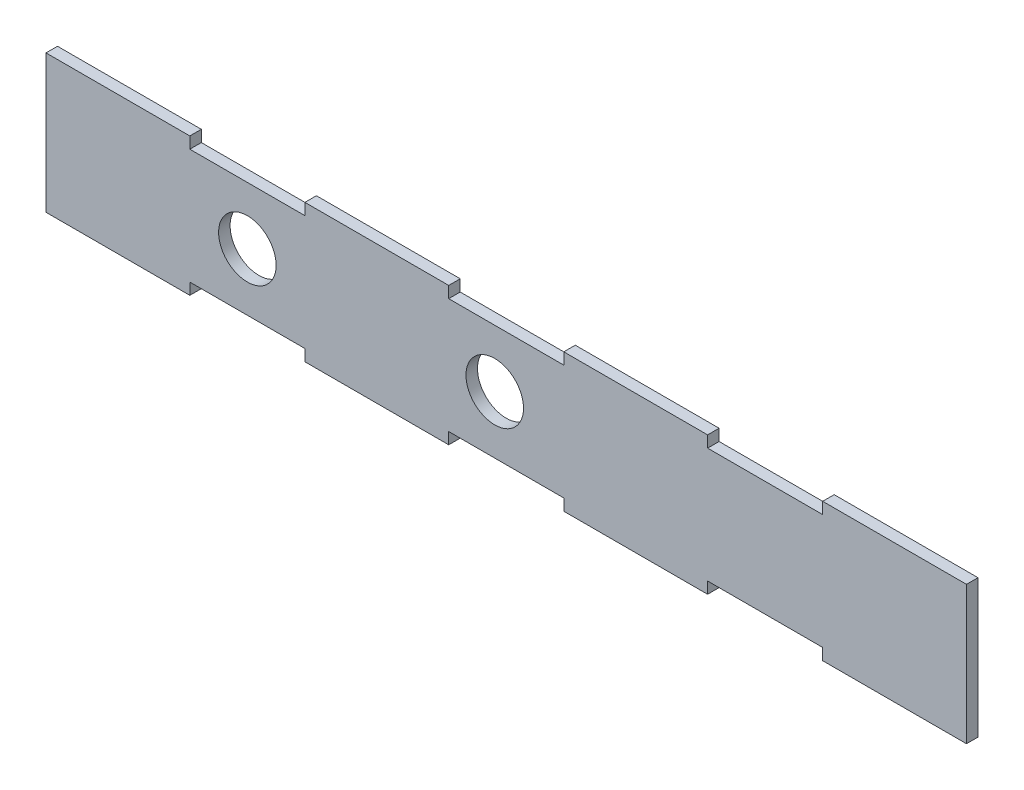
ISO-10303-21;
HEADER;
FILE_DESCRIPTION(('STEP AP214'),'2;1');
FILE_NAME('part.step','',(''),(''),'','','');
FILE_SCHEMA(('AUTOMOTIVE_DESIGN { 1 0 10303 214 1 1 1 1 }'));
ENDSEC;
DATA;
#1=APPLICATION_CONTEXT('core data for automotive mechanical design processes');
#2=APPLICATION_PROTOCOL_DEFINITION('international standard','automotive_design',2000,#1);
#3=PRODUCT_CONTEXT('',#1,'mechanical');
#4=PRODUCT('Part','Part','',(#3));
#5=PRODUCT_RELATED_PRODUCT_CATEGORY('part','',(#4));
#6=PRODUCT_DEFINITION_FORMATION('','',#4);
#7=PRODUCT_DEFINITION_CONTEXT('part definition',#1,'design');
#8=PRODUCT_DEFINITION('design','',#6,#7);
#9=PRODUCT_DEFINITION_SHAPE('','',#8);
#10=(LENGTH_UNIT() NAMED_UNIT(*) SI_UNIT(.MILLI.,.METRE.));
#11=(NAMED_UNIT(*) PLANE_ANGLE_UNIT() SI_UNIT($,.RADIAN.));
#12=(NAMED_UNIT(*) SI_UNIT($,.STERADIAN.) SOLID_ANGLE_UNIT());
#13=UNCERTAINTY_MEASURE_WITH_UNIT(LENGTH_MEASURE(1.E-05),#10,'distance_accuracy_value','');
#14=(GEOMETRIC_REPRESENTATION_CONTEXT(3) GLOBAL_UNCERTAINTY_ASSIGNED_CONTEXT((#13)) GLOBAL_UNIT_ASSIGNED_CONTEXT((#10,
#11,#12)) REPRESENTATION_CONTEXT('',''));
#15=CARTESIAN_POINT('',(0.,0.,0.));
#16=DIRECTION('',(0.,0.,1.));
#17=DIRECTION('',(1.,0.,0.));
#18=AXIS2_PLACEMENT_3D('',#15,#16,#17);
#19=CARTESIAN_POINT('',(115.,0.,2.));
#20=DIRECTION('',(-1.,0.,0.));
#21=DIRECTION('',(0.,0.,1.));
#22=AXIS2_PLACEMENT_3D('',#19,#20,#21);
#23=PLANE('',#22);
#24=DIRECTION('',(0.,1.,0.));
#25=VECTOR('',#24,1.);
#26=CARTESIAN_POINT('',(115.,0.,0.));
#27=LINE('',#26,#25);
#28=CARTESIAN_POINT('',(115.,0.,0.));
#29=VERTEX_POINT('',#28);
#30=CARTESIAN_POINT('',(115.,2.,0.));
#31=VERTEX_POINT('',#30);
#32=EDGE_CURVE('E261',#29,#31,#27,.T.);
#33=ORIENTED_EDGE('',*,*,#32,.T.);
#34=DIRECTION('',(0.,0.,-1.));
#35=VECTOR('',#34,1.);
#36=CARTESIAN_POINT('',(115.,2.,2.));
#37=LINE('',#36,#35);
#38=CARTESIAN_POINT('',(115.,2.,2.));
#39=VERTEX_POINT('',#38);
#40=EDGE_CURVE('E11',#39,#31,#37,.T.);
#41=ORIENTED_EDGE('',*,*,#40,.F.);
#42=DIRECTION('',(0.,1.,0.));
#43=VECTOR('',#42,1.);
#44=CARTESIAN_POINT('',(115.,0.,2.));
#45=LINE('',#44,#43);
#46=CARTESIAN_POINT('',(115.,0.,2.));
#47=VERTEX_POINT('',#46);
#48=EDGE_CURVE('E853',#47,#39,#45,.T.);
#49=ORIENTED_EDGE('',*,*,#48,.F.);
#50=DIRECTION('',(0.,0.,-1.));
#51=VECTOR('',#50,1.);
#52=CARTESIAN_POINT('',(115.,0.,2.));
#53=LINE('',#52,#51);
#54=EDGE_CURVE('E54',#47,#29,#53,.T.);
#55=ORIENTED_EDGE('',*,*,#54,.T.);
#56=EDGE_LOOP('',(#33,#41,#49,#55));
#57=FACE_BOUND('',#56,.T.);
#58=ADVANCED_FACE('F37',(#57),#23,.F.);
#59=CARTESIAN_POINT('',(0.,2.,2.));
#60=DIRECTION('',(0.,1.,0.));
#61=DIRECTION('',(0.,0.,1.));
#62=AXIS2_PLACEMENT_3D('',#59,#60,#61);
#63=PLANE('',#62);
#64=DIRECTION('',(1.,0.,0.));
#65=VECTOR('',#64,1.);
#66=CARTESIAN_POINT('',(0.,2.,0.));
#67=LINE('',#66,#65);
#68=CARTESIAN_POINT('',(135.,2.,0.));
#69=VERTEX_POINT('',#68);
#70=EDGE_CURVE('E263',#31,#69,#67,.T.);
#71=ORIENTED_EDGE('',*,*,#70,.T.);
#72=DIRECTION('',(0.,0.,-1.));
#73=VECTOR('',#72,1.);
#74=CARTESIAN_POINT('',(135.,2.,2.));
#75=LINE('',#74,#73);
#76=CARTESIAN_POINT('',(135.,2.,2.));
#77=VERTEX_POINT('',#76);
#78=EDGE_CURVE('E46',#77,#69,#75,.T.);
#79=ORIENTED_EDGE('',*,*,#78,.F.);
#80=DIRECTION('',(1.,0.,0.));
#81=VECTOR('',#80,1.);
#82=CARTESIAN_POINT('',(0.,2.,2.));
#83=LINE('',#82,#81);
#84=EDGE_CURVE('E152',#39,#77,#83,.T.);
#85=ORIENTED_EDGE('',*,*,#84,.F.);
#86=ORIENTED_EDGE('',*,*,#40,.T.);
#87=EDGE_LOOP('',(#71,#79,#85,#86));
#88=FACE_BOUND('',#87,.T.);
#89=ADVANCED_FACE('F393',(#88),#63,.F.);
#90=CARTESIAN_POINT('',(135.,0.,2.));
#91=DIRECTION('',(-1.,0.,0.));
#92=DIRECTION('',(0.,0.,1.));
#93=AXIS2_PLACEMENT_3D('',#90,#91,#92);
#94=PLANE('',#93);
#95=DIRECTION('',(0.,1.,0.));
#96=VECTOR('',#95,1.);
#97=CARTESIAN_POINT('',(135.,0.,0.));
#98=LINE('',#97,#96);
#99=CARTESIAN_POINT('',(135.,0.,0.));
#100=VERTEX_POINT('',#99);
#101=EDGE_CURVE('E266',#100,#69,#98,.T.);
#102=ORIENTED_EDGE('',*,*,#101,.F.);
#103=DIRECTION('',(0.,0.,-1.));
#104=VECTOR('',#103,1.);
#105=CARTESIAN_POINT('',(135.,0.,2.));
#106=LINE('',#105,#104);
#107=CARTESIAN_POINT('',(135.,0.,2.));
#108=VERTEX_POINT('',#107);
#109=EDGE_CURVE('E386',#108,#100,#106,.T.);
#110=ORIENTED_EDGE('',*,*,#109,.F.);
#111=DIRECTION('',(0.,1.,0.));
#112=VECTOR('',#111,1.);
#113=CARTESIAN_POINT('',(135.,0.,2.));
#114=LINE('',#113,#112);
#115=EDGE_CURVE('E392',#108,#77,#114,.T.);
#116=ORIENTED_EDGE('',*,*,#115,.T.);
#117=ORIENTED_EDGE('',*,*,#78,.T.);
#118=EDGE_LOOP('',(#102,#110,#116,#117));
#119=FACE_BOUND('',#118,.T.);
#120=ADVANCED_FACE('F390',(#119),#94,.T.);
#121=CARTESIAN_POINT('',(0.,0.,2.));
#122=DIRECTION('',(0.,1.,0.));
#123=DIRECTION('',(-1.,0.,0.));
#124=AXIS2_PLACEMENT_3D('',#121,#122,#123);
#125=PLANE('',#124);
#126=DIRECTION('',(1.,0.,0.));
#127=VECTOR('',#126,1.);
#128=CARTESIAN_POINT('',(0.,0.,0.));
#129=LINE('',#128,#127);
#130=CARTESIAN_POINT('',(160.,0.,0.));
#131=VERTEX_POINT('',#130);
#132=EDGE_CURVE('E269',#100,#131,#129,.T.);
#133=ORIENTED_EDGE('',*,*,#132,.T.);
#134=DIRECTION('',(0.,0.,-1.));
#135=VECTOR('',#134,1.);
#136=CARTESIAN_POINT('',(160.,0.,2.));
#137=LINE('',#136,#135);
#138=CARTESIAN_POINT('',(160.,0.,2.));
#139=VERTEX_POINT('',#138);
#140=EDGE_CURVE('E383',#139,#131,#137,.T.);
#141=ORIENTED_EDGE('',*,*,#140,.F.);
#142=DIRECTION('',(1.,0.,0.));
#143=VECTOR('',#142,1.);
#144=CARTESIAN_POINT('',(0.,0.,2.));
#145=LINE('',#144,#143);
#146=EDGE_CURVE('E411',#108,#139,#145,.T.);
#147=ORIENTED_EDGE('',*,*,#146,.F.);
#148=ORIENTED_EDGE('',*,*,#109,.T.);
#149=EDGE_LOOP('',(#133,#141,#147,#148));
#150=FACE_BOUND('',#149,.T.);
#151=ADVANCED_FACE('F402',(#150),#125,.F.);
#152=CARTESIAN_POINT('',(160.,0.,2.));
#153=DIRECTION('',(-1.,0.,0.));
#154=DIRECTION('',(0.,0.,1.));
#155=AXIS2_PLACEMENT_3D('',#152,#153,#154);
#156=PLANE('',#155);
#157=DIRECTION('',(0.,1.,0.));
#158=VECTOR('',#157,1.);
#159=CARTESIAN_POINT('',(160.,0.,0.));
#160=LINE('',#159,#158);
#161=CARTESIAN_POINT('',(160.,24.,0.));
#162=VERTEX_POINT('',#161);
#163=EDGE_CURVE('E271',#131,#162,#160,.T.);
#164=ORIENTED_EDGE('',*,*,#163,.T.);
#165=DIRECTION('',(0.,0.,-1.));
#166=VECTOR('',#165,1.);
#167=CARTESIAN_POINT('',(160.,24.,2.));
#168=LINE('',#167,#166);
#169=CARTESIAN_POINT('',(160.,24.,2.));
#170=VERTEX_POINT('',#169);
#171=EDGE_CURVE('E380',#170,#162,#168,.T.);
#172=ORIENTED_EDGE('',*,*,#171,.F.);
#173=DIRECTION('',(0.,1.,0.));
#174=VECTOR('',#173,1.);
#175=CARTESIAN_POINT('',(160.,0.,2.));
#176=LINE('',#175,#174);
#177=EDGE_CURVE('E408',#139,#170,#176,.T.);
#178=ORIENTED_EDGE('',*,*,#177,.F.);
#179=ORIENTED_EDGE('',*,*,#140,.T.);
#180=EDGE_LOOP('',(#164,#172,#178,#179));
#181=FACE_BOUND('',#180,.T.);
#182=ADVANCED_FACE('F406',(#181),#156,.F.);
#183=CARTESIAN_POINT('',(0.,24.,2.));
#184=DIRECTION('',(0.,-1.,0.));
#185=DIRECTION('',(1.,0.,0.));
#186=AXIS2_PLACEMENT_3D('',#183,#184,#185);
#187=PLANE('',#186);
#188=DIRECTION('',(-1.,0.,0.));
#189=VECTOR('',#188,1.);
#190=CARTESIAN_POINT('',(0.,24.,0.));
#191=LINE('',#190,#189);
#192=CARTESIAN_POINT('',(135.,24.,0.));
#193=VERTEX_POINT('',#192);
#194=EDGE_CURVE('E273',#162,#193,#191,.T.);
#195=ORIENTED_EDGE('',*,*,#194,.T.);
#196=DIRECTION('',(0.,0.,-1.));
#197=VECTOR('',#196,1.);
#198=CARTESIAN_POINT('',(135.,24.,2.));
#199=LINE('',#198,#197);
#200=CARTESIAN_POINT('',(135.,24.,2.));
#201=VERTEX_POINT('',#200);
#202=EDGE_CURVE('E377',#201,#193,#199,.T.);
#203=ORIENTED_EDGE('',*,*,#202,.F.);
#204=DIRECTION('',(-1.,0.,0.));
#205=VECTOR('',#204,1.);
#206=CARTESIAN_POINT('',(0.,24.,2.));
#207=LINE('',#206,#205);
#208=EDGE_CURVE('E410',#170,#201,#207,.T.);
#209=ORIENTED_EDGE('',*,*,#208,.F.);
#210=ORIENTED_EDGE('',*,*,#171,.T.);
#211=EDGE_LOOP('',(#195,#203,#209,#210));
#212=FACE_BOUND('',#211,.T.);
#213=ADVANCED_FACE('F735',(#212),#187,.F.);
#214=CARTESIAN_POINT('',(135.,0.,2.));
#215=DIRECTION('',(1.,0.,0.));
#216=DIRECTION('',(0.,0.,-1.));
#217=AXIS2_PLACEMENT_3D('',#214,#215,#216);
#218=PLANE('',#217);
#219=DIRECTION('',(0.,-1.,0.));
#220=VECTOR('',#219,1.);
#221=CARTESIAN_POINT('',(135.,0.,0.));
#222=LINE('',#221,#220);
#223=CARTESIAN_POINT('',(135.,22.,0.));
#224=VERTEX_POINT('',#223);
#225=EDGE_CURVE('E275',#193,#224,#222,.T.);
#226=ORIENTED_EDGE('',*,*,#225,.T.);
#227=DIRECTION('',(0.,0.,-1.));
#228=VECTOR('',#227,1.);
#229=CARTESIAN_POINT('',(135.,22.,2.));
#230=LINE('',#229,#228);
#231=CARTESIAN_POINT('',(135.,22.,2.));
#232=VERTEX_POINT('',#231);
#233=EDGE_CURVE('E375',#232,#224,#230,.T.);
#234=ORIENTED_EDGE('',*,*,#233,.F.);
#235=DIRECTION('',(0.,-1.,0.));
#236=VECTOR('',#235,1.);
#237=CARTESIAN_POINT('',(135.,0.,2.));
#238=LINE('',#237,#236);
#239=EDGE_CURVE('E413',#201,#232,#238,.T.);
#240=ORIENTED_EDGE('',*,*,#239,.F.);
#241=ORIENTED_EDGE('',*,*,#202,.T.);
#242=EDGE_LOOP('',(#226,#234,#240,#241));
#243=FACE_BOUND('',#242,.T.);
#244=ADVANCED_FACE('F725',(#243),#218,.F.);
#245=CARTESIAN_POINT('',(0.,22.,2.));
#246=DIRECTION('',(0.,1.,0.));
#247=DIRECTION('',(0.,0.,1.));
#248=AXIS2_PLACEMENT_3D('',#245,#246,#247);
#249=PLANE('',#248);
#250=DIRECTION('',(1.,0.,0.));
#251=VECTOR('',#250,1.);
#252=CARTESIAN_POINT('',(0.,22.,0.));
#253=LINE('',#252,#251);
#254=CARTESIAN_POINT('',(115.,22.,0.));
#255=VERTEX_POINT('',#254);
#256=EDGE_CURVE('E278',#255,#224,#253,.T.);
#257=ORIENTED_EDGE('',*,*,#256,.F.);
#258=DIRECTION('',(0.,0.,-1.));
#259=VECTOR('',#258,1.);
#260=CARTESIAN_POINT('',(115.,22.,2.));
#261=LINE('',#260,#259);
#262=CARTESIAN_POINT('',(115.,22.,2.));
#263=VERTEX_POINT('',#262);
#264=EDGE_CURVE('E373',#263,#255,#261,.T.);
#265=ORIENTED_EDGE('',*,*,#264,.F.);
#266=DIRECTION('',(1.,0.,0.));
#267=VECTOR('',#266,1.);
#268=CARTESIAN_POINT('',(0.,22.,2.));
#269=LINE('',#268,#267);
#270=EDGE_CURVE('E419',#263,#232,#269,.T.);
#271=ORIENTED_EDGE('',*,*,#270,.T.);
#272=ORIENTED_EDGE('',*,*,#233,.T.);
#273=EDGE_LOOP('',(#257,#265,#271,#272));
#274=FACE_BOUND('',#273,.T.);
#275=ADVANCED_FACE('F715',(#274),#249,.T.);
#276=CARTESIAN_POINT('',(115.,0.,2.));
#277=DIRECTION('',(1.,0.,0.));
#278=DIRECTION('',(0.,0.,-1.));
#279=AXIS2_PLACEMENT_3D('',#276,#277,#278);
#280=PLANE('',#279);
#281=DIRECTION('',(0.,-1.,0.));
#282=VECTOR('',#281,1.);
#283=CARTESIAN_POINT('',(115.,0.,0.));
#284=LINE('',#283,#282);
#285=CARTESIAN_POINT('',(115.,24.,0.));
#286=VERTEX_POINT('',#285);
#287=EDGE_CURVE('E281',#286,#255,#284,.T.);
#288=ORIENTED_EDGE('',*,*,#287,.F.);
#289=DIRECTION('',(0.,0.,-1.));
#290=VECTOR('',#289,1.);
#291=CARTESIAN_POINT('',(115.,24.,2.));
#292=LINE('',#291,#290);
#293=CARTESIAN_POINT('',(115.,24.,2.));
#294=VERTEX_POINT('',#293);
#295=EDGE_CURVE('E371',#294,#286,#292,.T.);
#296=ORIENTED_EDGE('',*,*,#295,.F.);
#297=DIRECTION('',(0.,-1.,0.));
#298=VECTOR('',#297,1.);
#299=CARTESIAN_POINT('',(115.,0.,2.));
#300=LINE('',#299,#298);
#301=EDGE_CURVE('E422',#294,#263,#300,.T.);
#302=ORIENTED_EDGE('',*,*,#301,.T.);
#303=ORIENTED_EDGE('',*,*,#264,.T.);
#304=EDGE_LOOP('',(#288,#296,#302,#303));
#305=FACE_BOUND('',#304,.T.);
#306=ADVANCED_FACE('F704',(#305),#280,.T.);
#307=CARTESIAN_POINT('',(0.,24.,2.));
#308=DIRECTION('',(0.,1.,0.));
#309=DIRECTION('',(0.,0.,1.));
#310=AXIS2_PLACEMENT_3D('',#307,#308,#309);
#311=PLANE('',#310);
#312=DIRECTION('',(1.,0.,0.));
#313=VECTOR('',#312,1.);
#314=CARTESIAN_POINT('',(0.,24.,0.));
#315=LINE('',#314,#313);
#316=CARTESIAN_POINT('',(90.,24.,0.));
#317=VERTEX_POINT('',#316);
#318=EDGE_CURVE('E284',#317,#286,#315,.T.);
#319=ORIENTED_EDGE('',*,*,#318,.F.);
#320=DIRECTION('',(0.,0.,-1.));
#321=VECTOR('',#320,1.);
#322=CARTESIAN_POINT('',(90.,24.,2.));
#323=LINE('',#322,#321);
#324=CARTESIAN_POINT('',(90.,24.,2.));
#325=VERTEX_POINT('',#324);
#326=EDGE_CURVE('E369',#325,#317,#323,.T.);
#327=ORIENTED_EDGE('',*,*,#326,.F.);
#328=DIRECTION('',(1.,0.,0.));
#329=VECTOR('',#328,1.);
#330=CARTESIAN_POINT('',(0.,24.,2.));
#331=LINE('',#330,#329);
#332=EDGE_CURVE('E425',#325,#294,#331,.T.);
#333=ORIENTED_EDGE('',*,*,#332,.T.);
#334=ORIENTED_EDGE('',*,*,#295,.T.);
#335=EDGE_LOOP('',(#319,#327,#333,#334));
#336=FACE_BOUND('',#335,.T.);
#337=ADVANCED_FACE('F694',(#336),#311,.T.);
#338=CARTESIAN_POINT('',(90.,0.,2.));
#339=DIRECTION('',(1.,0.,0.));
#340=DIRECTION('',(0.,0.,-1.));
#341=AXIS2_PLACEMENT_3D('',#338,#339,#340);
#342=PLANE('',#341);
#343=DIRECTION('',(0.,-1.,0.));
#344=VECTOR('',#343,1.);
#345=CARTESIAN_POINT('',(90.,0.,0.));
#346=LINE('',#345,#344);
#347=CARTESIAN_POINT('',(90.,22.,0.));
#348=VERTEX_POINT('',#347);
#349=EDGE_CURVE('E287',#317,#348,#346,.T.);
#350=ORIENTED_EDGE('',*,*,#349,.T.);
#351=DIRECTION('',(0.,0.,-1.));
#352=VECTOR('',#351,1.);
#353=CARTESIAN_POINT('',(90.,22.,2.));
#354=LINE('',#353,#352);
#355=CARTESIAN_POINT('',(90.,22.,2.));
#356=VERTEX_POINT('',#355);
#357=EDGE_CURVE('E367',#356,#348,#354,.T.);
#358=ORIENTED_EDGE('',*,*,#357,.F.);
#359=DIRECTION('',(0.,-1.,0.));
#360=VECTOR('',#359,1.);
#361=CARTESIAN_POINT('',(90.,0.,2.));
#362=LINE('',#361,#360);
#363=EDGE_CURVE('E428',#325,#356,#362,.T.);
#364=ORIENTED_EDGE('',*,*,#363,.F.);
#365=ORIENTED_EDGE('',*,*,#326,.T.);
#366=EDGE_LOOP('',(#350,#358,#364,#365));
#367=FACE_BOUND('',#366,.T.);
#368=ADVANCED_FACE('F684',(#367),#342,.F.);
#369=CARTESIAN_POINT('',(0.,22.,2.));
#370=DIRECTION('',(0.,1.,0.));
#371=DIRECTION('',(0.,0.,1.));
#372=AXIS2_PLACEMENT_3D('',#369,#370,#371);
#373=PLANE('',#372);
#374=DIRECTION('',(1.,0.,0.));
#375=VECTOR('',#374,1.);
#376=CARTESIAN_POINT('',(0.,22.,0.));
#377=LINE('',#376,#375);
#378=CARTESIAN_POINT('',(70.,22.,0.));
#379=VERTEX_POINT('',#378);
#380=EDGE_CURVE('E290',#379,#348,#377,.T.);
#381=ORIENTED_EDGE('',*,*,#380,.F.);
#382=DIRECTION('',(0.,0.,-1.));
#383=VECTOR('',#382,1.);
#384=CARTESIAN_POINT('',(70.,22.,2.));
#385=LINE('',#384,#383);
#386=CARTESIAN_POINT('',(70.,22.,2.));
#387=VERTEX_POINT('',#386);
#388=EDGE_CURVE('E365',#387,#379,#385,.T.);
#389=ORIENTED_EDGE('',*,*,#388,.F.);
#390=DIRECTION('',(1.,0.,0.));
#391=VECTOR('',#390,1.);
#392=CARTESIAN_POINT('',(0.,22.,2.));
#393=LINE('',#392,#391);
#394=EDGE_CURVE('E430',#387,#356,#393,.T.);
#395=ORIENTED_EDGE('',*,*,#394,.T.);
#396=ORIENTED_EDGE('',*,*,#357,.T.);
#397=EDGE_LOOP('',(#381,#389,#395,#396));
#398=FACE_BOUND('',#397,.T.);
#399=ADVANCED_FACE('F674',(#398),#373,.T.);
#400=CARTESIAN_POINT('',(70.,0.,2.));
#401=DIRECTION('',(1.,0.,0.));
#402=DIRECTION('',(0.,0.,-1.));
#403=AXIS2_PLACEMENT_3D('',#400,#401,#402);
#404=PLANE('',#403);
#405=DIRECTION('',(0.,-1.,0.));
#406=VECTOR('',#405,1.);
#407=CARTESIAN_POINT('',(70.,0.,0.));
#408=LINE('',#407,#406);
#409=CARTESIAN_POINT('',(70.,24.,0.));
#410=VERTEX_POINT('',#409);
#411=EDGE_CURVE('E293',#410,#379,#408,.T.);
#412=ORIENTED_EDGE('',*,*,#411,.F.);
#413=DIRECTION('',(0.,0.,-1.));
#414=VECTOR('',#413,1.);
#415=CARTESIAN_POINT('',(70.,24.,2.));
#416=LINE('',#415,#414);
#417=CARTESIAN_POINT('',(70.,24.,2.));
#418=VERTEX_POINT('',#417);
#419=EDGE_CURVE('E363',#418,#410,#416,.T.);
#420=ORIENTED_EDGE('',*,*,#419,.F.);
#421=DIRECTION('',(0.,-1.,0.));
#422=VECTOR('',#421,1.);
#423=CARTESIAN_POINT('',(70.,0.,2.));
#424=LINE('',#423,#422);
#425=EDGE_CURVE('E433',#418,#387,#424,.T.);
#426=ORIENTED_EDGE('',*,*,#425,.T.);
#427=ORIENTED_EDGE('',*,*,#388,.T.);
#428=EDGE_LOOP('',(#412,#420,#426,#427));
#429=FACE_BOUND('',#428,.T.);
#430=ADVANCED_FACE('F663',(#429),#404,.T.);
#431=CARTESIAN_POINT('',(0.,24.,2.));
#432=DIRECTION('',(0.,1.,0.));
#433=DIRECTION('',(0.,0.,1.));
#434=AXIS2_PLACEMENT_3D('',#431,#432,#433);
#435=PLANE('',#434);
#436=DIRECTION('',(1.,0.,0.));
#437=VECTOR('',#436,1.);
#438=CARTESIAN_POINT('',(0.,24.,0.));
#439=LINE('',#438,#437);
#440=CARTESIAN_POINT('',(45.,24.,0.));
#441=VERTEX_POINT('',#440);
#442=EDGE_CURVE('E296',#441,#410,#439,.T.);
#443=ORIENTED_EDGE('',*,*,#442,.F.);
#444=DIRECTION('',(0.,0.,-1.));
#445=VECTOR('',#444,1.);
#446=CARTESIAN_POINT('',(45.,24.,2.));
#447=LINE('',#446,#445);
#448=CARTESIAN_POINT('',(45.,24.,2.));
#449=VERTEX_POINT('',#448);
#450=EDGE_CURVE('E361',#449,#441,#447,.T.);
#451=ORIENTED_EDGE('',*,*,#450,.F.);
#452=DIRECTION('',(1.,0.,0.));
#453=VECTOR('',#452,1.);
#454=CARTESIAN_POINT('',(0.,24.,2.));
#455=LINE('',#454,#453);
#456=EDGE_CURVE('E436',#449,#418,#455,.T.);
#457=ORIENTED_EDGE('',*,*,#456,.T.);
#458=ORIENTED_EDGE('',*,*,#419,.T.);
#459=EDGE_LOOP('',(#443,#451,#457,#458));
#460=FACE_BOUND('',#459,.T.);
#461=ADVANCED_FACE('F653',(#460),#435,.T.);
#462=CARTESIAN_POINT('',(45.,0.,2.));
#463=DIRECTION('',(1.,0.,0.));
#464=DIRECTION('',(0.,0.,-1.));
#465=AXIS2_PLACEMENT_3D('',#462,#463,#464);
#466=PLANE('',#465);
#467=DIRECTION('',(0.,-1.,0.));
#468=VECTOR('',#467,1.);
#469=CARTESIAN_POINT('',(45.,0.,0.));
#470=LINE('',#469,#468);
#471=CARTESIAN_POINT('',(45.,22.,0.));
#472=VERTEX_POINT('',#471);
#473=EDGE_CURVE('E299',#441,#472,#470,.T.);
#474=ORIENTED_EDGE('',*,*,#473,.T.);
#475=DIRECTION('',(0.,0.,-1.));
#476=VECTOR('',#475,1.);
#477=CARTESIAN_POINT('',(45.,22.,2.));
#478=LINE('',#477,#476);
#479=CARTESIAN_POINT('',(45.,22.,2.));
#480=VERTEX_POINT('',#479);
#481=EDGE_CURVE('E359',#480,#472,#478,.T.);
#482=ORIENTED_EDGE('',*,*,#481,.F.);
#483=DIRECTION('',(0.,-1.,0.));
#484=VECTOR('',#483,1.);
#485=CARTESIAN_POINT('',(45.,0.,2.));
#486=LINE('',#485,#484);
#487=EDGE_CURVE('E439',#449,#480,#486,.T.);
#488=ORIENTED_EDGE('',*,*,#487,.F.);
#489=ORIENTED_EDGE('',*,*,#450,.T.);
#490=EDGE_LOOP('',(#474,#482,#488,#489));
#491=FACE_BOUND('',#490,.T.);
#492=ADVANCED_FACE('F642',(#491),#466,.F.);
#493=CARTESIAN_POINT('',(0.,22.,2.));
#494=DIRECTION('',(0.,1.,0.));
#495=DIRECTION('',(0.,0.,1.));
#496=AXIS2_PLACEMENT_3D('',#493,#494,#495);
#497=PLANE('',#496);
#498=DIRECTION('',(1.,0.,0.));
#499=VECTOR('',#498,1.);
#500=CARTESIAN_POINT('',(0.,22.,0.));
#501=LINE('',#500,#499);
#502=CARTESIAN_POINT('',(25.,22.,0.));
#503=VERTEX_POINT('',#502);
#504=EDGE_CURVE('E302',#503,#472,#501,.T.);
#505=ORIENTED_EDGE('',*,*,#504,.F.);
#506=DIRECTION('',(0.,0.,-1.));
#507=VECTOR('',#506,1.);
#508=CARTESIAN_POINT('',(25.,22.,2.));
#509=LINE('',#508,#507);
#510=CARTESIAN_POINT('',(25.,22.,2.));
#511=VERTEX_POINT('',#510);
#512=EDGE_CURVE('E357',#511,#503,#509,.T.);
#513=ORIENTED_EDGE('',*,*,#512,.F.);
#514=DIRECTION('',(1.,0.,0.));
#515=VECTOR('',#514,1.);
#516=CARTESIAN_POINT('',(0.,22.,2.));
#517=LINE('',#516,#515);
#518=EDGE_CURVE('E441',#511,#480,#517,.T.);
#519=ORIENTED_EDGE('',*,*,#518,.T.);
#520=ORIENTED_EDGE('',*,*,#481,.T.);
#521=EDGE_LOOP('',(#505,#513,#519,#520));
#522=FACE_BOUND('',#521,.T.);
#523=ADVANCED_FACE('F632',(#522),#497,.T.);
#524=CARTESIAN_POINT('',(25.,0.,2.));
#525=DIRECTION('',(1.,0.,0.));
#526=DIRECTION('',(0.,0.,-1.));
#527=AXIS2_PLACEMENT_3D('',#524,#525,#526);
#528=PLANE('',#527);
#529=DIRECTION('',(0.,-1.,0.));
#530=VECTOR('',#529,1.);
#531=CARTESIAN_POINT('',(25.,0.,0.));
#532=LINE('',#531,#530);
#533=CARTESIAN_POINT('',(25.,24.,0.));
#534=VERTEX_POINT('',#533);
#535=EDGE_CURVE('E305',#534,#503,#532,.T.);
#536=ORIENTED_EDGE('',*,*,#535,.F.);
#537=DIRECTION('',(0.,0.,-1.));
#538=VECTOR('',#537,1.);
#539=CARTESIAN_POINT('',(25.,24.,2.));
#540=LINE('',#539,#538);
#541=CARTESIAN_POINT('',(25.,24.,2.));
#542=VERTEX_POINT('',#541);
#543=EDGE_CURVE('E355',#542,#534,#540,.T.);
#544=ORIENTED_EDGE('',*,*,#543,.F.);
#545=DIRECTION('',(0.,-1.,0.));
#546=VECTOR('',#545,1.);
#547=CARTESIAN_POINT('',(25.,0.,2.));
#548=LINE('',#547,#546);
#549=EDGE_CURVE('E444',#542,#511,#548,.T.);
#550=ORIENTED_EDGE('',*,*,#549,.T.);
#551=ORIENTED_EDGE('',*,*,#512,.T.);
#552=EDGE_LOOP('',(#536,#544,#550,#551));
#553=FACE_BOUND('',#552,.T.);
#554=ADVANCED_FACE('F620',(#553),#528,.T.);
#555=CARTESIAN_POINT('',(0.,24.,2.));
#556=DIRECTION('',(0.,1.,0.));
#557=DIRECTION('',(0.,0.,1.));
#558=AXIS2_PLACEMENT_3D('',#555,#556,#557);
#559=PLANE('',#558);
#560=DIRECTION('',(1.,0.,0.));
#561=VECTOR('',#560,1.);
#562=CARTESIAN_POINT('',(0.,24.,0.));
#563=LINE('',#562,#561);
#564=CARTESIAN_POINT('',(0.,24.,0.));
#565=VERTEX_POINT('',#564);
#566=EDGE_CURVE('E308',#565,#534,#563,.T.);
#567=ORIENTED_EDGE('',*,*,#566,.F.);
#568=DIRECTION('',(0.,0.,-1.));
#569=VECTOR('',#568,1.);
#570=CARTESIAN_POINT('',(0.,24.,2.));
#571=LINE('',#570,#569);
#572=CARTESIAN_POINT('',(0.,24.,2.));
#573=VERTEX_POINT('',#572);
#574=EDGE_CURVE('E353',#573,#565,#571,.T.);
#575=ORIENTED_EDGE('',*,*,#574,.F.);
#576=DIRECTION('',(1.,0.,0.));
#577=VECTOR('',#576,1.);
#578=CARTESIAN_POINT('',(0.,24.,2.));
#579=LINE('',#578,#577);
#580=EDGE_CURVE('E447',#573,#542,#579,.T.);
#581=ORIENTED_EDGE('',*,*,#580,.T.);
#582=ORIENTED_EDGE('',*,*,#543,.T.);
#583=EDGE_LOOP('',(#567,#575,#581,#582));
#584=FACE_BOUND('',#583,.T.);
#585=ADVANCED_FACE('F609',(#584),#559,.T.);
#586=CARTESIAN_POINT('',(0.,0.,2.));
#587=DIRECTION('',(-1.,0.,0.));
#588=DIRECTION('',(0.,0.,1.));
#589=AXIS2_PLACEMENT_3D('',#586,#587,#588);
#590=PLANE('',#589);
#591=DIRECTION('',(0.,1.,0.));
#592=VECTOR('',#591,1.);
#593=CARTESIAN_POINT('',(0.,0.,0.));
#594=LINE('',#593,#592);
#595=CARTESIAN_POINT('',(0.,0.,0.));
#596=VERTEX_POINT('',#595);
#597=EDGE_CURVE('E311',#596,#565,#594,.T.);
#598=ORIENTED_EDGE('',*,*,#597,.F.);
#599=DIRECTION('',(0.,0.,-1.));
#600=VECTOR('',#599,1.);
#601=CARTESIAN_POINT('',(0.,0.,2.));
#602=LINE('',#601,#600);
#603=CARTESIAN_POINT('',(0.,0.,2.));
#604=VERTEX_POINT('',#603);
#605=EDGE_CURVE('E351',#604,#596,#602,.T.);
#606=ORIENTED_EDGE('',*,*,#605,.F.);
#607=DIRECTION('',(0.,1.,0.));
#608=VECTOR('',#607,1.);
#609=CARTESIAN_POINT('',(0.,0.,2.));
#610=LINE('',#609,#608);
#611=EDGE_CURVE('E450',#604,#573,#610,.T.);
#612=ORIENTED_EDGE('',*,*,#611,.T.);
#613=ORIENTED_EDGE('',*,*,#574,.T.);
#614=EDGE_LOOP('',(#598,#606,#612,#613));
#615=FACE_BOUND('',#614,.T.);
#616=ADVANCED_FACE('F598',(#615),#590,.T.);
#617=CARTESIAN_POINT('',(0.,0.,2.));
#618=DIRECTION('',(0.,1.,0.));
#619=DIRECTION('',(0.,0.,1.));
#620=AXIS2_PLACEMENT_3D('',#617,#618,#619);
#621=PLANE('',#620);
#622=DIRECTION('',(1.,0.,0.));
#623=VECTOR('',#622,1.);
#624=CARTESIAN_POINT('',(0.,0.,0.));
#625=LINE('',#624,#623);
#626=CARTESIAN_POINT('',(25.,0.,0.));
#627=VERTEX_POINT('',#626);
#628=EDGE_CURVE('E314',#596,#627,#625,.T.);
#629=ORIENTED_EDGE('',*,*,#628,.T.);
#630=DIRECTION('',(0.,0.,-1.));
#631=VECTOR('',#630,1.);
#632=CARTESIAN_POINT('',(25.,0.,2.));
#633=LINE('',#632,#631);
#634=CARTESIAN_POINT('',(25.,0.,2.));
#635=VERTEX_POINT('',#634);
#636=EDGE_CURVE('E348',#635,#627,#633,.T.);
#637=ORIENTED_EDGE('',*,*,#636,.F.);
#638=DIRECTION('',(1.,0.,0.));
#639=VECTOR('',#638,1.);
#640=CARTESIAN_POINT('',(0.,0.,2.));
#641=LINE('',#640,#639);
#642=EDGE_CURVE('E453',#604,#635,#641,.T.);
#643=ORIENTED_EDGE('',*,*,#642,.F.);
#644=ORIENTED_EDGE('',*,*,#605,.T.);
#645=EDGE_LOOP('',(#629,#637,#643,#644));
#646=FACE_BOUND('',#645,.T.);
#647=ADVANCED_FACE('F588',(#646),#621,.F.);
#648=CARTESIAN_POINT('',(25.,0.,2.));
#649=DIRECTION('',(-1.,0.,0.));
#650=DIRECTION('',(0.,0.,1.));
#651=AXIS2_PLACEMENT_3D('',#648,#649,#650);
#652=PLANE('',#651);
#653=DIRECTION('',(0.,1.,0.));
#654=VECTOR('',#653,1.);
#655=CARTESIAN_POINT('',(25.,0.,0.));
#656=LINE('',#655,#654);
#657=CARTESIAN_POINT('',(25.,2.,0.));
#658=VERTEX_POINT('',#657);
#659=EDGE_CURVE('E316',#627,#658,#656,.T.);
#660=ORIENTED_EDGE('',*,*,#659,.T.);
#661=DIRECTION('',(0.,0.,-1.));
#662=VECTOR('',#661,1.);
#663=CARTESIAN_POINT('',(25.,2.,2.));
#664=LINE('',#663,#662);
#665=CARTESIAN_POINT('',(25.,2.,2.));
#666=VERTEX_POINT('',#665);
#667=EDGE_CURVE('E345',#666,#658,#664,.T.);
#668=ORIENTED_EDGE('',*,*,#667,.F.);
#669=DIRECTION('',(0.,1.,0.));
#670=VECTOR('',#669,1.);
#671=CARTESIAN_POINT('',(25.,0.,2.));
#672=LINE('',#671,#670);
#673=EDGE_CURVE('E455',#635,#666,#672,.T.);
#674=ORIENTED_EDGE('',*,*,#673,.F.);
#675=ORIENTED_EDGE('',*,*,#636,.T.);
#676=EDGE_LOOP('',(#660,#668,#674,#675));
#677=FACE_BOUND('',#676,.T.);
#678=ADVANCED_FACE('F578',(#677),#652,.F.);
#679=CARTESIAN_POINT('',(0.,2.,2.));
#680=DIRECTION('',(0.,1.,0.));
#681=DIRECTION('',(0.,0.,1.));
#682=AXIS2_PLACEMENT_3D('',#679,#680,#681);
#683=PLANE('',#682);
#684=DIRECTION('',(1.,0.,0.));
#685=VECTOR('',#684,1.);
#686=CARTESIAN_POINT('',(0.,2.,0.));
#687=LINE('',#686,#685);
#688=CARTESIAN_POINT('',(45.,2.,0.));
#689=VERTEX_POINT('',#688);
#690=EDGE_CURVE('E318',#658,#689,#687,.T.);
#691=ORIENTED_EDGE('',*,*,#690,.T.);
#692=DIRECTION('',(0.,0.,-1.));
#693=VECTOR('',#692,1.);
#694=CARTESIAN_POINT('',(45.,2.,2.));
#695=LINE('',#694,#693);
#696=CARTESIAN_POINT('',(45.,2.,2.));
#697=VERTEX_POINT('',#696);
#698=EDGE_CURVE('E343',#697,#689,#695,.T.);
#699=ORIENTED_EDGE('',*,*,#698,.F.);
#700=DIRECTION('',(1.,0.,0.));
#701=VECTOR('',#700,1.);
#702=CARTESIAN_POINT('',(0.,2.,2.));
#703=LINE('',#702,#701);
#704=EDGE_CURVE('E457',#666,#697,#703,.T.);
#705=ORIENTED_EDGE('',*,*,#704,.F.);
#706=ORIENTED_EDGE('',*,*,#667,.T.);
#707=EDGE_LOOP('',(#691,#699,#705,#706));
#708=FACE_BOUND('',#707,.T.);
#709=ADVANCED_FACE('F568',(#708),#683,.F.);
#710=CARTESIAN_POINT('',(45.,0.,2.));
#711=DIRECTION('',(-1.,0.,0.));
#712=DIRECTION('',(0.,0.,1.));
#713=AXIS2_PLACEMENT_3D('',#710,#711,#712);
#714=PLANE('',#713);
#715=DIRECTION('',(0.,1.,0.));
#716=VECTOR('',#715,1.);
#717=CARTESIAN_POINT('',(45.,0.,0.));
#718=LINE('',#717,#716);
#719=CARTESIAN_POINT('',(45.,0.,0.));
#720=VERTEX_POINT('',#719);
#721=EDGE_CURVE('E321',#720,#689,#718,.T.);
#722=ORIENTED_EDGE('',*,*,#721,.F.);
#723=DIRECTION('',(0.,0.,-1.));
#724=VECTOR('',#723,1.);
#725=CARTESIAN_POINT('',(45.,0.,2.));
#726=LINE('',#725,#724);
#727=CARTESIAN_POINT('',(45.,0.,2.));
#728=VERTEX_POINT('',#727);
#729=EDGE_CURVE('E341',#728,#720,#726,.T.);
#730=ORIENTED_EDGE('',*,*,#729,.F.);
#731=DIRECTION('',(0.,1.,0.));
#732=VECTOR('',#731,1.);
#733=CARTESIAN_POINT('',(45.,0.,2.));
#734=LINE('',#733,#732);
#735=EDGE_CURVE('E459',#728,#697,#734,.T.);
#736=ORIENTED_EDGE('',*,*,#735,.T.);
#737=ORIENTED_EDGE('',*,*,#698,.T.);
#738=EDGE_LOOP('',(#722,#730,#736,#737));
#739=FACE_BOUND('',#738,.T.);
#740=ADVANCED_FACE('F558',(#739),#714,.T.);
#741=CARTESIAN_POINT('',(0.,0.,2.));
#742=DIRECTION('',(0.,1.,0.));
#743=DIRECTION('',(0.,0.,1.));
#744=AXIS2_PLACEMENT_3D('',#741,#742,#743);
#745=PLANE('',#744);
#746=DIRECTION('',(1.,0.,0.));
#747=VECTOR('',#746,1.);
#748=CARTESIAN_POINT('',(0.,0.,0.));
#749=LINE('',#748,#747);
#750=CARTESIAN_POINT('',(70.,0.,0.));
#751=VERTEX_POINT('',#750);
#752=EDGE_CURVE('E324',#720,#751,#749,.T.);
#753=ORIENTED_EDGE('',*,*,#752,.T.);
#754=DIRECTION('',(0.,0.,-1.));
#755=VECTOR('',#754,1.);
#756=CARTESIAN_POINT('',(70.,0.,2.));
#757=LINE('',#756,#755);
#758=CARTESIAN_POINT('',(70.,0.,2.));
#759=VERTEX_POINT('',#758);
#760=EDGE_CURVE('E338',#759,#751,#757,.T.);
#761=ORIENTED_EDGE('',*,*,#760,.F.);
#762=DIRECTION('',(1.,0.,0.));
#763=VECTOR('',#762,1.);
#764=CARTESIAN_POINT('',(0.,0.,2.));
#765=LINE('',#764,#763);
#766=EDGE_CURVE('E462',#728,#759,#765,.T.);
#767=ORIENTED_EDGE('',*,*,#766,.F.);
#768=ORIENTED_EDGE('',*,*,#729,.T.);
#769=EDGE_LOOP('',(#753,#761,#767,#768));
#770=FACE_BOUND('',#769,.T.);
#771=ADVANCED_FACE('F467',(#770),#745,.F.);
#772=CARTESIAN_POINT('',(70.,0.,2.));
#773=DIRECTION('',(-1.,0.,0.));
#774=DIRECTION('',(0.,0.,1.));
#775=AXIS2_PLACEMENT_3D('',#772,#773,#774);
#776=PLANE('',#775);
#777=DIRECTION('',(0.,1.,0.));
#778=VECTOR('',#777,1.);
#779=CARTESIAN_POINT('',(70.,0.,0.));
#780=LINE('',#779,#778);
#781=CARTESIAN_POINT('',(70.,2.,0.));
#782=VERTEX_POINT('',#781);
#783=EDGE_CURVE('E326',#751,#782,#780,.T.);
#784=ORIENTED_EDGE('',*,*,#783,.T.);
#785=DIRECTION('',(0.,0.,-1.));
#786=VECTOR('',#785,1.);
#787=CARTESIAN_POINT('',(70.,2.,2.));
#788=LINE('',#787,#786);
#789=CARTESIAN_POINT('',(70.,2.,2.));
#790=VERTEX_POINT('',#789);
#791=EDGE_CURVE('E247',#790,#782,#788,.T.);
#792=ORIENTED_EDGE('',*,*,#791,.F.);
#793=DIRECTION('',(0.,1.,0.));
#794=VECTOR('',#793,1.);
#795=CARTESIAN_POINT('',(70.,0.,2.));
#796=LINE('',#795,#794);
#797=EDGE_CURVE('E235',#759,#790,#796,.T.);
#798=ORIENTED_EDGE('',*,*,#797,.F.);
#799=ORIENTED_EDGE('',*,*,#760,.T.);
#800=EDGE_LOOP('',(#784,#792,#798,#799));
#801=FACE_BOUND('',#800,.T.);
#802=ADVANCED_FACE('F471',(#801),#776,.F.);
#803=CARTESIAN_POINT('',(0.,2.,2.));
#804=DIRECTION('',(0.,1.,0.));
#805=DIRECTION('',(0.,0.,1.));
#806=AXIS2_PLACEMENT_3D('',#803,#804,#805);
#807=PLANE('',#806);
#808=DIRECTION('',(1.,0.,0.));
#809=VECTOR('',#808,1.);
#810=CARTESIAN_POINT('',(0.,2.,0.));
#811=LINE('',#810,#809);
#812=CARTESIAN_POINT('',(90.,2.,0.));
#813=VERTEX_POINT('',#812);
#814=EDGE_CURVE('E244',#782,#813,#811,.T.);
#815=ORIENTED_EDGE('',*,*,#814,.T.);
#816=DIRECTION('',(0.,0.,-1.));
#817=VECTOR('',#816,1.);
#818=CARTESIAN_POINT('',(90.,2.,2.));
#819=LINE('',#818,#817);
#820=CARTESIAN_POINT('',(90.,2.,2.));
#821=VERTEX_POINT('',#820);
#822=EDGE_CURVE('E241',#821,#813,#819,.T.);
#823=ORIENTED_EDGE('',*,*,#822,.F.);
#824=DIRECTION('',(1.,0.,0.));
#825=VECTOR('',#824,1.);
#826=CARTESIAN_POINT('',(0.,2.,2.));
#827=LINE('',#826,#825);
#828=EDGE_CURVE('E228',#790,#821,#827,.T.);
#829=ORIENTED_EDGE('',*,*,#828,.F.);
#830=ORIENTED_EDGE('',*,*,#791,.T.);
#831=EDGE_LOOP('',(#815,#823,#829,#830));
#832=FACE_BOUND('',#831,.T.);
#833=ADVANCED_FACE('F242',(#832),#807,.F.);
#834=CARTESIAN_POINT('',(90.,0.,2.));
#835=DIRECTION('',(-1.,0.,0.));
#836=DIRECTION('',(0.,0.,1.));
#837=AXIS2_PLACEMENT_3D('',#834,#835,#836);
#838=PLANE('',#837);
#839=DIRECTION('',(0.,1.,0.));
#840=VECTOR('',#839,1.);
#841=CARTESIAN_POINT('',(90.,0.,0.));
#842=LINE('',#841,#840);
#843=CARTESIAN_POINT('',(90.,0.,0.));
#844=VERTEX_POINT('',#843);
#845=EDGE_CURVE('E329',#844,#813,#842,.T.);
#846=ORIENTED_EDGE('',*,*,#845,.F.);
#847=DIRECTION('',(0.,0.,-1.));
#848=VECTOR('',#847,1.);
#849=CARTESIAN_POINT('',(90.,0.,2.));
#850=LINE('',#849,#848);
#851=CARTESIAN_POINT('',(90.,0.,2.));
#852=VERTEX_POINT('',#851);
#853=EDGE_CURVE('E140',#852,#844,#850,.T.);
#854=ORIENTED_EDGE('',*,*,#853,.F.);
#855=DIRECTION('',(0.,1.,0.));
#856=VECTOR('',#855,1.);
#857=CARTESIAN_POINT('',(90.,0.,2.));
#858=LINE('',#857,#856);
#859=EDGE_CURVE('E233',#852,#821,#858,.T.);
#860=ORIENTED_EDGE('',*,*,#859,.T.);
#861=ORIENTED_EDGE('',*,*,#822,.T.);
#862=EDGE_LOOP('',(#846,#854,#860,#861));
#863=FACE_BOUND('',#862,.T.);
#864=ADVANCED_FACE('F249',(#863),#838,.T.);
#865=CARTESIAN_POINT('',(78.,12.,2.));
#866=DIRECTION('',(0.,0.,-1.));
#867=DIRECTION('',(-1.,0.,0.));
#868=AXIS2_PLACEMENT_3D('',#865,#866,#867);
#869=CYLINDRICAL_SURFACE('',#868,4.99999999999999);
#870=CARTESIAN_POINT('',(78.,12.,2.));
#871=DIRECTION('',(0.,0.,1.));
#872=DIRECTION('',(1.,0.,0.));
#873=AXIS2_PLACEMENT_3D('',#870,#871,#872);
#874=CIRCLE('',#873,4.99999999999999);
#875=CARTESIAN_POINT('',(83.,12.,2.));
#876=VERTEX_POINT('',#875);
#877=EDGE_CURVE('E500',#876,#876,#874,.T.);
#878=ORIENTED_EDGE('',*,*,#877,.T.);
#879=EDGE_LOOP('',(#878));
#880=FACE_BOUND('',#879,.T.);
#881=CARTESIAN_POINT('',(78.,12.,0.));
#882=DIRECTION('',(0.,0.,1.));
#883=DIRECTION('',(1.,0.,0.));
#884=AXIS2_PLACEMENT_3D('',#881,#882,#883);
#885=CIRCLE('',#884,4.99999999999999);
#886=CARTESIAN_POINT('',(83.,12.,0.));
#887=VERTEX_POINT('',#886);
#888=EDGE_CURVE('E258',#887,#887,#885,.T.);
#889=ORIENTED_EDGE('',*,*,#888,.F.);
#890=EDGE_LOOP('',(#889));
#891=FACE_BOUND('',#890,.T.);
#892=ADVANCED_FACE('F481',(#880,#891),#869,.F.);
#893=CARTESIAN_POINT('',(35.,12.,2.));
#894=DIRECTION('',(0.,0.,-1.));
#895=DIRECTION('',(-1.,0.,0.));
#896=AXIS2_PLACEMENT_3D('',#893,#894,#895);
#897=CYLINDRICAL_SURFACE('',#896,5.);
#898=CARTESIAN_POINT('',(35.,12.,2.));
#899=DIRECTION('',(0.,0.,1.));
#900=DIRECTION('',(1.,0.,0.));
#901=AXIS2_PLACEMENT_3D('',#898,#899,#900);
#902=CIRCLE('',#901,5.);
#903=CARTESIAN_POINT('',(40.,12.,2.));
#904=VERTEX_POINT('',#903);
#905=EDGE_CURVE('E334',#904,#904,#902,.T.);
#906=ORIENTED_EDGE('',*,*,#905,.T.);
#907=EDGE_LOOP('',(#906));
#908=FACE_BOUND('',#907,.T.);
#909=CARTESIAN_POINT('',(35.,12.,0.));
#910=DIRECTION('',(0.,0.,1.));
#911=DIRECTION('',(1.,0.,0.));
#912=AXIS2_PLACEMENT_3D('',#909,#910,#911);
#913=CIRCLE('',#912,5.);
#914=CARTESIAN_POINT('',(40.,12.,0.));
#915=VERTEX_POINT('',#914);
#916=EDGE_CURVE('E255',#915,#915,#913,.T.);
#917=ORIENTED_EDGE('',*,*,#916,.F.);
#918=EDGE_LOOP('',(#917));
#919=FACE_BOUND('',#918,.T.);
#920=ADVANCED_FACE('F39',(#908,#919),#897,.F.);
#921=CARTESIAN_POINT('',(0.,0.,2.));
#922=DIRECTION('',(0.,-1.,0.));
#923=DIRECTION('',(0.,0.,-1.));
#924=AXIS2_PLACEMENT_3D('',#921,#922,#923);
#925=PLANE('',#924);
#926=DIRECTION('',(-1.,0.,0.));
#927=VECTOR('',#926,1.);
#928=CARTESIAN_POINT('',(0.,0.,0.));
#929=LINE('',#928,#927);
#930=EDGE_CURVE('E331',#29,#844,#929,.T.);
#931=ORIENTED_EDGE('',*,*,#930,.F.);
#932=ORIENTED_EDGE('',*,*,#54,.F.);
#933=DIRECTION('',(-1.,0.,0.));
#934=VECTOR('',#933,1.);
#935=CARTESIAN_POINT('',(0.,0.,2.));
#936=LINE('',#935,#934);
#937=EDGE_CURVE('E250',#47,#852,#936,.T.);
#938=ORIENTED_EDGE('',*,*,#937,.T.);
#939=ORIENTED_EDGE('',*,*,#853,.T.);
#940=EDGE_LOOP('',(#931,#932,#938,#939));
#941=FACE_BOUND('',#940,.T.);
#942=ADVANCED_FACE('F472',(#941),#925,.T.);
#943=CARTESIAN_POINT('',(0.,0.,2.));
#944=DIRECTION('',(0.,0.,1.));
#945=DIRECTION('',(1.,0.,0.));
#946=AXIS2_PLACEMENT_3D('',#943,#944,#945);
#947=PLANE('',#946);
#948=ORIENTED_EDGE('',*,*,#905,.F.);
#949=EDGE_LOOP('',(#948));
#950=FACE_BOUND('',#949,.T.);
#951=ORIENTED_EDGE('',*,*,#877,.F.);
#952=EDGE_LOOP('',(#951));
#953=FACE_BOUND('',#952,.T.);
#954=ORIENTED_EDGE('',*,*,#48,.T.);
#955=ORIENTED_EDGE('',*,*,#84,.T.);
#956=ORIENTED_EDGE('',*,*,#115,.F.);
#957=ORIENTED_EDGE('',*,*,#146,.T.);
#958=ORIENTED_EDGE('',*,*,#177,.T.);
#959=ORIENTED_EDGE('',*,*,#208,.T.);
#960=ORIENTED_EDGE('',*,*,#239,.T.);
#961=ORIENTED_EDGE('',*,*,#270,.F.);
#962=ORIENTED_EDGE('',*,*,#301,.F.);
#963=ORIENTED_EDGE('',*,*,#332,.F.);
#964=ORIENTED_EDGE('',*,*,#363,.T.);
#965=ORIENTED_EDGE('',*,*,#394,.F.);
#966=ORIENTED_EDGE('',*,*,#425,.F.);
#967=ORIENTED_EDGE('',*,*,#456,.F.);
#968=ORIENTED_EDGE('',*,*,#487,.T.);
#969=ORIENTED_EDGE('',*,*,#518,.F.);
#970=ORIENTED_EDGE('',*,*,#549,.F.);
#971=ORIENTED_EDGE('',*,*,#580,.F.);
#972=ORIENTED_EDGE('',*,*,#611,.F.);
#973=ORIENTED_EDGE('',*,*,#642,.T.);
#974=ORIENTED_EDGE('',*,*,#673,.T.);
#975=ORIENTED_EDGE('',*,*,#704,.T.);
#976=ORIENTED_EDGE('',*,*,#735,.F.);
#977=ORIENTED_EDGE('',*,*,#766,.T.);
#978=ORIENTED_EDGE('',*,*,#797,.T.);
#979=ORIENTED_EDGE('',*,*,#828,.T.);
#980=ORIENTED_EDGE('',*,*,#859,.F.);
#981=ORIENTED_EDGE('',*,*,#937,.F.);
#982=EDGE_LOOP('',(#954,#955,#956,#957,#958,#959,#960,#961,#962,#963,#964,#965,#966,#967,#968,
#969,#970,#971,#972,#973,#974,#975,#976,#977,#978,#979,#980,#981));
#983=FACE_BOUND('',#982,.T.);
#984=ADVANCED_FACE('F230',(#950,#953,#983),#947,.T.);
#985=CARTESIAN_POINT('',(0.,0.,0.));
#986=DIRECTION('',(0.,0.,1.));
#987=DIRECTION('',(1.,0.,0.));
#988=AXIS2_PLACEMENT_3D('',#985,#986,#987);
#989=PLANE('',#988);
#990=ORIENTED_EDGE('',*,*,#916,.T.);
#991=EDGE_LOOP('',(#990));
#992=FACE_BOUND('',#991,.T.);
#993=ORIENTED_EDGE('',*,*,#888,.T.);
#994=EDGE_LOOP('',(#993));
#995=FACE_BOUND('',#994,.T.);
#996=ORIENTED_EDGE('',*,*,#32,.F.);
#997=ORIENTED_EDGE('',*,*,#930,.T.);
#998=ORIENTED_EDGE('',*,*,#845,.T.);
#999=ORIENTED_EDGE('',*,*,#814,.F.);
#1000=ORIENTED_EDGE('',*,*,#783,.F.);
#1001=ORIENTED_EDGE('',*,*,#752,.F.);
#1002=ORIENTED_EDGE('',*,*,#721,.T.);
#1003=ORIENTED_EDGE('',*,*,#690,.F.);
#1004=ORIENTED_EDGE('',*,*,#659,.F.);
#1005=ORIENTED_EDGE('',*,*,#628,.F.);
#1006=ORIENTED_EDGE('',*,*,#597,.T.);
#1007=ORIENTED_EDGE('',*,*,#566,.T.);
#1008=ORIENTED_EDGE('',*,*,#535,.T.);
#1009=ORIENTED_EDGE('',*,*,#504,.T.);
#1010=ORIENTED_EDGE('',*,*,#473,.F.);
#1011=ORIENTED_EDGE('',*,*,#442,.T.);
#1012=ORIENTED_EDGE('',*,*,#411,.T.);
#1013=ORIENTED_EDGE('',*,*,#380,.T.);
#1014=ORIENTED_EDGE('',*,*,#349,.F.);
#1015=ORIENTED_EDGE('',*,*,#318,.T.);
#1016=ORIENTED_EDGE('',*,*,#287,.T.);
#1017=ORIENTED_EDGE('',*,*,#256,.T.);
#1018=ORIENTED_EDGE('',*,*,#225,.F.);
#1019=ORIENTED_EDGE('',*,*,#194,.F.);
#1020=ORIENTED_EDGE('',*,*,#163,.F.);
#1021=ORIENTED_EDGE('',*,*,#132,.F.);
#1022=ORIENTED_EDGE('',*,*,#101,.T.);
#1023=ORIENTED_EDGE('',*,*,#70,.F.);
#1024=EDGE_LOOP('',(#996,#997,#998,#999,#1000,#1001,#1002,#1003,#1004,#1005,#1006,#1007,#1008,
#1009,#1010,#1011,#1012,#1013,#1014,#1015,#1016,#1017,#1018,#1019,#1020,#1021,#1022,#1023));
#1025=FACE_BOUND('',#1024,.T.);
#1026=ADVANCED_FACE('F397',(#992,#995,#1025),#989,.F.);
#1027=CLOSED_SHELL('',(#58,#89,#120,#151,#182,#213,#244,#275,#306,#337,#368,#399,#430,#461,#492,
#523,#554,#585,#616,#647,#678,#709,#740,#771,#802,#833,#864,#892,#920,#942,#984,#1026));
#1028=MANIFOLD_SOLID_BREP('B2',#1027);
#1029=ADVANCED_BREP_SHAPE_REPRESENTATION('',(#18,#1028),#14);
#1030=SHAPE_DEFINITION_REPRESENTATION(#9,#1029);
ENDSEC;
END-ISO-10303-21;
